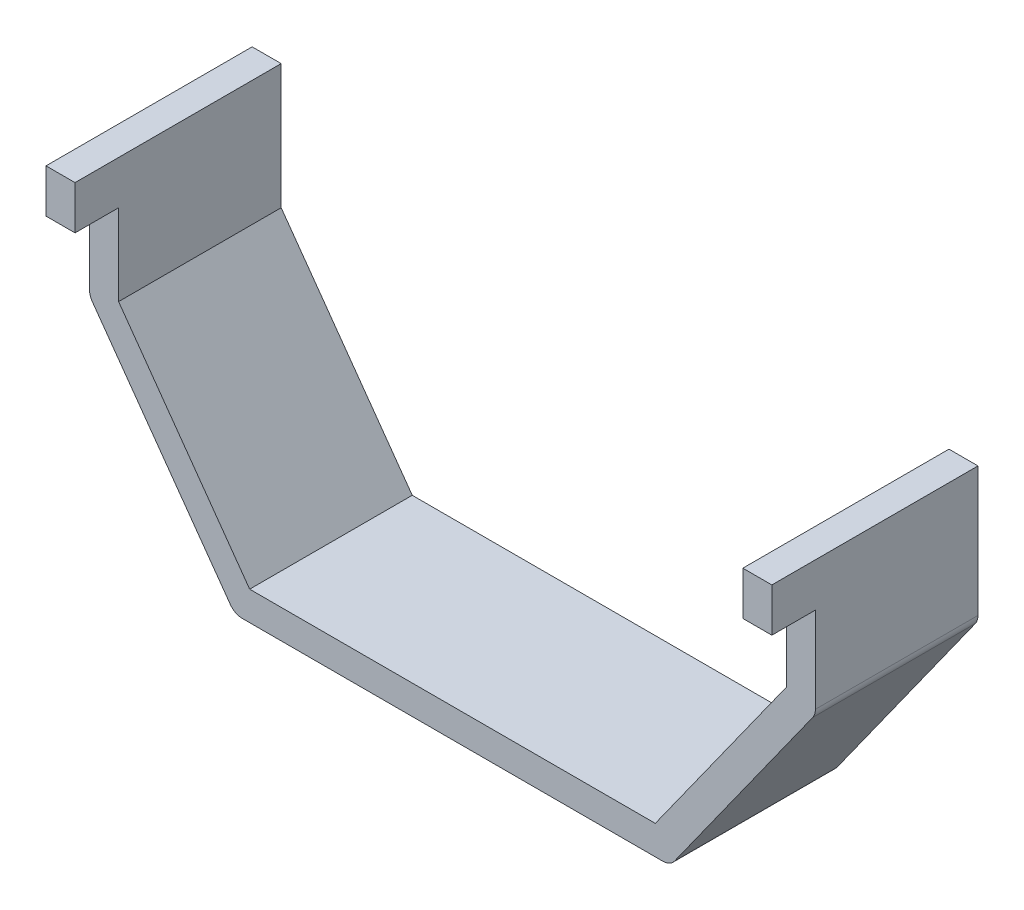
ISO-10303-21;
HEADER;
FILE_DESCRIPTION(('STEP AP214'),'2;1');
FILE_NAME('part.step','',(''),(''),'','','');
FILE_SCHEMA(('AUTOMOTIVE_DESIGN { 1 0 10303 214 1 1 1 1 }'));
ENDSEC;
DATA;
#1=APPLICATION_CONTEXT('core data for automotive mechanical design processes');
#2=APPLICATION_PROTOCOL_DEFINITION('international standard','automotive_design',2000,#1);
#3=PRODUCT_CONTEXT('',#1,'mechanical');
#4=PRODUCT('Part','Part','',(#3));
#5=PRODUCT_RELATED_PRODUCT_CATEGORY('part','',(#4));
#6=PRODUCT_DEFINITION_FORMATION('','',#4);
#7=PRODUCT_DEFINITION_CONTEXT('part definition',#1,'design');
#8=PRODUCT_DEFINITION('design','',#6,#7);
#9=PRODUCT_DEFINITION_SHAPE('','',#8);
#10=(LENGTH_UNIT() NAMED_UNIT(*) SI_UNIT(.MILLI.,.METRE.));
#11=(NAMED_UNIT(*) PLANE_ANGLE_UNIT() SI_UNIT($,.RADIAN.));
#12=(NAMED_UNIT(*) SI_UNIT($,.STERADIAN.) SOLID_ANGLE_UNIT());
#13=UNCERTAINTY_MEASURE_WITH_UNIT(LENGTH_MEASURE(1.E-05),#10,'distance_accuracy_value','');
#14=(GEOMETRIC_REPRESENTATION_CONTEXT(3) GLOBAL_UNCERTAINTY_ASSIGNED_CONTEXT((#13)) GLOBAL_UNIT_ASSIGNED_CONTEXT((#10,
#11,#12)) REPRESENTATION_CONTEXT('',''));
#15=CARTESIAN_POINT('',(0.,0.,0.));
#16=DIRECTION('',(0.,0.,1.));
#17=DIRECTION('',(1.,0.,0.));
#18=AXIS2_PLACEMENT_3D('',#15,#16,#17);
#19=CARTESIAN_POINT('',(-124.998147320026,69.9973261243957,71.));
#20=DIRECTION('',(0.813733156526339,0.581238634271398,0.));
#21=DIRECTION('',(-0.581238634271398,0.81373315652634,0.));
#22=AXIS2_PLACEMENT_3D('',#19,#20,#21);
#23=PLANE('',#22);
#24=DIRECTION('',(0.581238634271398,-0.81373315652634,0.));
#25=VECTOR('',#24,1.);
#26=CARTESIAN_POINT('',(-124.998147320026,69.9973261243957,56.));
#27=LINE('',#26,#25);
#28=CARTESIAN_POINT('',(-124.066813102657,68.6934597125732,56.));
#29=VERTEX_POINT('',#28);
#30=CARTESIAN_POINT('',(-76.4955780181107,2.09380682864299,56.));
#31=VERTEX_POINT('',#30);
#32=EDGE_CURVE('E315',#29,#31,#27,.T.);
#33=ORIENTED_EDGE('',*,*,#32,.F.);
#34=DIRECTION('',(0.,0.,-1.));
#35=VECTOR('',#34,1.);
#36=CARTESIAN_POINT('',(-124.066813102657,68.6934597125732,71.));
#37=LINE('',#36,#35);
#38=CARTESIAN_POINT('',(-124.066813102657,68.6934597125732,0.));
#39=VERTEX_POINT('',#38);
#40=EDGE_CURVE('E264',#29,#39,#37,.T.);
#41=ORIENTED_EDGE('',*,*,#40,.T.);
#42=DIRECTION('',(0.581238634271398,-0.813733156526339,0.));
#43=VECTOR('',#42,1.);
#44=CARTESIAN_POINT('',(-124.998147320026,69.9973261243957,0.));
#45=LINE('',#44,#43);
#46=CARTESIAN_POINT('',(-76.4955780181107,2.09380682864303,0.));
#47=VERTEX_POINT('',#46);
#48=EDGE_CURVE('E216',#39,#47,#45,.T.);
#49=ORIENTED_EDGE('',*,*,#48,.T.);
#50=DIRECTION('',(0.,0.,-1.));
#51=VECTOR('',#50,1.);
#52=CARTESIAN_POINT('',(-76.4955780181107,2.09380682864301,71.));
#53=LINE('',#52,#51);
#54=EDGE_CURVE('E262',#47,#31,#53,.F.);
#55=ORIENTED_EDGE('',*,*,#54,.T.);
#56=EDGE_LOOP('',(#33,#41,#49,#55));
#57=FACE_BOUND('',#56,.T.);
#58=ADVANCED_FACE('F33',(#57),#23,.F.);
#59=CARTESIAN_POINT('',(-75.,0.,71.));
#60=DIRECTION('',(0.,1.,0.));
#61=DIRECTION('',(-1.,0.,0.));
#62=AXIS2_PLACEMENT_3D('',#59,#60,#61);
#63=PLANE('',#62);
#64=DIRECTION('',(1.,0.,0.));
#65=VECTOR('',#64,1.);
#66=CARTESIAN_POINT('',(-75.,0.,56.));
#67=LINE('',#66,#65);
#68=CARTESIAN_POINT('',(-72.426912235479,0.,56.));
#69=VERTEX_POINT('',#68);
#70=CARTESIAN_POINT('',(72.4270796226592,0.,56.));
#71=VERTEX_POINT('',#70);
#72=EDGE_CURVE('E307',#69,#71,#67,.T.);
#73=ORIENTED_EDGE('',*,*,#72,.F.);
#74=DIRECTION('',(0.,0.,-1.));
#75=VECTOR('',#74,1.);
#76=CARTESIAN_POINT('',(-72.426912235479,0.,71.));
#77=LINE('',#76,#75);
#78=CARTESIAN_POINT('',(-72.426912235479,0.,0.));
#79=VERTEX_POINT('',#78);
#80=EDGE_CURVE('E286',#69,#79,#77,.T.);
#81=ORIENTED_EDGE('',*,*,#80,.T.);
#82=DIRECTION('',(1.,0.,0.));
#83=VECTOR('',#82,1.);
#84=CARTESIAN_POINT('',(-75.,0.,0.));
#85=LINE('',#84,#83);
#86=CARTESIAN_POINT('',(72.4270796226592,0.,0.));
#87=VERTEX_POINT('',#86);
#88=EDGE_CURVE('E220',#79,#87,#85,.T.);
#89=ORIENTED_EDGE('',*,*,#88,.T.);
#90=DIRECTION('',(0.,0.,-1.));
#91=VECTOR('',#90,1.);
#92=CARTESIAN_POINT('',(72.4270796226592,0.,71.));
#93=LINE('',#92,#91);
#94=EDGE_CURVE('E284',#87,#71,#93,.F.);
#95=ORIENTED_EDGE('',*,*,#94,.T.);
#96=EDGE_LOOP('',(#73,#81,#89,#95));
#97=FACE_BOUND('',#96,.T.);
#98=ADVANCED_FACE('F340',(#97),#63,.F.);
#99=CARTESIAN_POINT('',(75.,0.,71.));
#100=DIRECTION('',(-0.813702386626155,0.581281709671739,0.));
#101=DIRECTION('',(-0.581281709671739,-0.813702386626155,0.));
#102=AXIS2_PLACEMENT_3D('',#99,#100,#101);
#103=PLANE('',#102);
#104=DIRECTION('',(0.581281709671739,0.813702386626155,0.));
#105=VECTOR('',#104,1.);
#106=CARTESIAN_POINT('',(75.,0.,56.));
#107=LINE('',#106,#105);
#108=CARTESIAN_POINT('',(76.4955915557899,2.09359145164133,56.));
#109=VERTEX_POINT('',#108);
#110=CARTESIAN_POINT('',(124.070364599094,68.6907434425326,56.));
#111=VERTEX_POINT('',#110);
#112=EDGE_CURVE('E293',#109,#111,#107,.T.);
#113=ORIENTED_EDGE('',*,*,#112,.F.);
#114=DIRECTION('',(0.,0.,-1.));
#115=VECTOR('',#114,1.);
#116=CARTESIAN_POINT('',(76.4955915557899,2.09359145164133,71.));
#117=LINE('',#116,#115);
#118=CARTESIAN_POINT('',(76.4955915557899,2.09359145164133,0.));
#119=VERTEX_POINT('',#118);
#120=EDGE_CURVE('E41',#109,#119,#117,.T.);
#121=ORIENTED_EDGE('',*,*,#120,.T.);
#122=DIRECTION('',(0.581281709671739,0.813702386626155,0.));
#123=VECTOR('',#122,1.);
#124=CARTESIAN_POINT('',(75.,0.,0.));
#125=LINE('',#124,#123);
#126=CARTESIAN_POINT('',(124.070364599094,68.6907434425326,0.));
#127=VERTEX_POINT('',#126);
#128=EDGE_CURVE('E223',#119,#127,#125,.T.);
#129=ORIENTED_EDGE('',*,*,#128,.T.);
#130=DIRECTION('',(0.,0.,-1.));
#131=VECTOR('',#130,1.);
#132=CARTESIAN_POINT('',(124.070364599094,68.6907434425326,71.));
#133=LINE('',#132,#131);
#134=EDGE_CURVE('E56',#127,#111,#133,.F.);
#135=ORIENTED_EDGE('',*,*,#134,.T.);
#136=EDGE_LOOP('',(#113,#121,#129,#135));
#137=FACE_BOUND('',#136,.T.);
#138=ADVANCED_FACE('F292',(#137),#103,.F.);
#139=CARTESIAN_POINT('',(115.001852665963,73.1996246842009,71.));
#140=DIRECTION('',(0.813702386626155,-0.581281709671739,0.));
#141=DIRECTION('',(0.581281709671739,0.813702386626155,0.));
#142=AXIS2_PLACEMENT_3D('',#139,#140,#141);
#143=PLANE('',#142);
#144=DIRECTION('',(-0.581281709671739,-0.813702386626155,0.));
#145=VECTOR('',#144,1.);
#146=CARTESIAN_POINT('',(115.001852665963,73.1996246842009,56.));
#147=LINE('',#146,#145);
#148=CARTESIAN_POINT('',(115.001852665963,73.1996246842009,56.));
#149=VERTEX_POINT('',#148);
#150=CARTESIAN_POINT('',(69.8541592453183,9.99999999999998,56.));
#151=VERTEX_POINT('',#150);
#152=EDGE_CURVE('E309',#149,#151,#147,.T.);
#153=ORIENTED_EDGE('',*,*,#152,.F.);
#154=DIRECTION('',(0.,0.,-1.));
#155=VECTOR('',#154,1.);
#156=CARTESIAN_POINT('',(115.001852665963,73.1996246842009,71.));
#157=LINE('',#156,#155);
#158=CARTESIAN_POINT('',(115.001852665963,73.1996246842009,0.));
#159=VERTEX_POINT('',#158);
#160=EDGE_CURVE('E255',#149,#159,#157,.T.);
#161=ORIENTED_EDGE('',*,*,#160,.T.);
#162=DIRECTION('',(-0.581281709671739,-0.813702386626155,0.));
#163=VECTOR('',#162,1.);
#164=CARTESIAN_POINT('',(115.001852665963,73.1996246842009,0.));
#165=LINE('',#164,#163);
#166=CARTESIAN_POINT('',(69.8541592453183,9.99999999999998,0.));
#167=VERTEX_POINT('',#166);
#168=EDGE_CURVE('E232',#159,#167,#165,.T.);
#169=ORIENTED_EDGE('',*,*,#168,.T.);
#170=DIRECTION('',(0.,0.,-1.));
#171=VECTOR('',#170,1.);
#172=CARTESIAN_POINT('',(69.8541592453183,9.99999999999998,71.));
#173=LINE('',#172,#171);
#174=EDGE_CURVE('E253',#151,#167,#173,.T.);
#175=ORIENTED_EDGE('',*,*,#174,.F.);
#176=EDGE_LOOP('',(#153,#161,#169,#175));
#177=FACE_BOUND('',#176,.T.);
#178=ADVANCED_FACE('F397',(#177),#143,.F.);
#179=CARTESIAN_POINT('',(69.8541592453183,9.99999999999998,71.));
#180=DIRECTION('',(0.,-1.,0.));
#181=DIRECTION('',(1.,0.,0.));
#182=AXIS2_PLACEMENT_3D('',#179,#180,#181);
#183=PLANE('',#182);
#184=DIRECTION('',(-1.,0.,0.));
#185=VECTOR('',#184,1.);
#186=CARTESIAN_POINT('',(69.8541592453183,9.99999999999998,56.));
#187=LINE('',#186,#185);
#188=CARTESIAN_POINT('',(-69.8538244709579,9.99999999999998,56.));
#189=VERTEX_POINT('',#188);
#190=EDGE_CURVE('E568',#151,#189,#187,.T.);
#191=ORIENTED_EDGE('',*,*,#190,.F.);
#192=ORIENTED_EDGE('',*,*,#174,.T.);
#193=DIRECTION('',(-1.,0.,0.));
#194=VECTOR('',#193,1.);
#195=CARTESIAN_POINT('',(69.8541592453183,9.99999999999998,0.));
#196=LINE('',#195,#194);
#197=CARTESIAN_POINT('',(-69.8538244709579,9.99999999999998,0.));
#198=VERTEX_POINT('',#197);
#199=EDGE_CURVE('E235',#167,#198,#196,.T.);
#200=ORIENTED_EDGE('',*,*,#199,.T.);
#201=DIRECTION('',(0.,0.,-1.));
#202=VECTOR('',#201,1.);
#203=CARTESIAN_POINT('',(-69.8538244709579,9.99999999999998,71.));
#204=LINE('',#203,#202);
#205=EDGE_CURVE('E251',#189,#198,#204,.T.);
#206=ORIENTED_EDGE('',*,*,#205,.F.);
#207=EDGE_LOOP('',(#191,#192,#200,#206));
#208=FACE_BOUND('',#207,.T.);
#209=ADVANCED_FACE('F393',(#208),#183,.F.);
#210=CARTESIAN_POINT('',(-114.998147320026,73.2019796434646,71.));
#211=DIRECTION('',(-0.813733156526339,-0.581238634271398,0.));
#212=DIRECTION('',(0.581238634271398,-0.813733156526339,0.));
#213=AXIS2_PLACEMENT_3D('',#210,#211,#212);
#214=PLANE('',#213);
#215=DIRECTION('',(-0.581238634271398,0.813733156526339,0.));
#216=VECTOR('',#215,1.);
#217=CARTESIAN_POINT('',(-114.998147320026,73.2019796434646,56.));
#218=LINE('',#217,#216);
#219=CARTESIAN_POINT('',(-114.998147320026,73.2019796434646,56.));
#220=VERTEX_POINT('',#219);
#221=EDGE_CURVE('E566',#189,#220,#218,.T.);
#222=ORIENTED_EDGE('',*,*,#221,.F.);
#223=ORIENTED_EDGE('',*,*,#205,.T.);
#224=DIRECTION('',(-0.581238634271398,0.813733156526339,0.));
#225=VECTOR('',#224,1.);
#226=CARTESIAN_POINT('',(-114.998147320026,73.2019796434646,0.));
#227=LINE('',#226,#225);
#228=CARTESIAN_POINT('',(-114.998147320026,73.2019796434646,0.));
#229=VERTEX_POINT('',#228);
#230=EDGE_CURVE('E238',#198,#229,#227,.T.);
#231=ORIENTED_EDGE('',*,*,#230,.T.);
#232=DIRECTION('',(0.,0.,-1.));
#233=VECTOR('',#232,1.);
#234=CARTESIAN_POINT('',(-114.998147320026,73.2019796434646,71.));
#235=LINE('',#234,#233);
#236=EDGE_CURVE('E249',#220,#229,#235,.T.);
#237=ORIENTED_EDGE('',*,*,#236,.F.);
#238=EDGE_LOOP('',(#222,#223,#231,#237));
#239=FACE_BOUND('',#238,.T.);
#240=ADVANCED_FACE('F390',(#239),#214,.F.);
#241=CARTESIAN_POINT('',(0.,0.,71.));
#242=DIRECTION('',(0.,0.,1.));
#243=DIRECTION('',(1.,0.,0.));
#244=AXIS2_PLACEMENT_3D('',#241,#242,#243);
#245=PLANE('',#244);
#246=DIRECTION('',(-1.,0.,0.));
#247=VECTOR('',#246,1.);
#248=CARTESIAN_POINT('',(0.,101.194679297583,71.));
#249=LINE('',#248,#247);
#250=CARTESIAN_POINT('',(125.001852665963,101.194679297584,71.));
#251=VERTEX_POINT('',#250);
#252=CARTESIAN_POINT('',(115.001852665963,101.194679297584,71.));
#253=VERTEX_POINT('',#252);
#254=EDGE_CURVE('E175',#251,#253,#249,.T.);
#255=ORIENTED_EDGE('',*,*,#254,.F.);
#256=DIRECTION('',(0.,1.,0.));
#257=VECTOR('',#256,1.);
#258=CARTESIAN_POINT('',(125.001852665963,69.9946792975819,71.));
#259=LINE('',#258,#257);
#260=CARTESIAN_POINT('',(125.001852665963,116.194679297584,71.));
#261=VERTEX_POINT('',#260);
#262=EDGE_CURVE('E187',#251,#261,#259,.T.);
#263=ORIENTED_EDGE('',*,*,#262,.T.);
#264=DIRECTION('',(-1.,0.,0.));
#265=VECTOR('',#264,1.);
#266=CARTESIAN_POINT('',(125.001852665963,116.194679297584,71.));
#267=LINE('',#266,#265);
#268=CARTESIAN_POINT('',(115.001852665963,116.194679297584,71.));
#269=VERTEX_POINT('',#268);
#270=EDGE_CURVE('E198',#261,#269,#267,.T.);
#271=ORIENTED_EDGE('',*,*,#270,.T.);
#272=DIRECTION('',(0.,-1.,0.));
#273=VECTOR('',#272,1.);
#274=CARTESIAN_POINT('',(115.001852665963,116.194679297584,71.));
#275=LINE('',#274,#273);
#276=EDGE_CURVE('E190',#269,#253,#275,.T.);
#277=ORIENTED_EDGE('',*,*,#276,.T.);
#278=EDGE_LOOP('',(#255,#263,#271,#277));
#279=FACE_BOUND('',#278,.T.);
#280=ADVANCED_FACE('F186',(#279),#245,.T.);
#281=CARTESIAN_POINT('',(-124.998147320026,116.197326124396,71.));
#282=DIRECTION('',(1.,0.,0.));
#283=DIRECTION('',(0.,0.,-1.));
#284=AXIS2_PLACEMENT_3D('',#281,#282,#283);
#285=PLANE('',#284);
#286=DIRECTION('',(0.,-1.,0.));
#287=VECTOR('',#286,1.);
#288=CARTESIAN_POINT('',(-124.998147320026,116.197326124396,0.));
#289=LINE('',#288,#287);
#290=CARTESIAN_POINT('',(-124.998147320026,116.197326124396,0.));
#291=VERTEX_POINT('',#290);
#292=CARTESIAN_POINT('',(-124.998147320026,71.5996528839302,0.));
#293=VERTEX_POINT('',#292);
#294=EDGE_CURVE('E213',#291,#293,#289,.T.);
#295=ORIENTED_EDGE('',*,*,#294,.T.);
#296=DIRECTION('',(0.,0.,-1.));
#297=VECTOR('',#296,1.);
#298=CARTESIAN_POINT('',(-124.998147320026,71.5996528839301,71.));
#299=LINE('',#298,#297);
#300=CARTESIAN_POINT('',(-124.998147320026,71.5996528839301,56.));
#301=VERTEX_POINT('',#300);
#302=EDGE_CURVE('E275',#293,#301,#299,.F.);
#303=ORIENTED_EDGE('',*,*,#302,.T.);
#304=DIRECTION('',(0.,-1.,0.));
#305=VECTOR('',#304,1.);
#306=CARTESIAN_POINT('',(-124.998147320026,116.197326124396,56.));
#307=LINE('',#306,#305);
#308=CARTESIAN_POINT('',(-124.998147320026,101.194679297583,56.));
#309=VERTEX_POINT('',#308);
#310=EDGE_CURVE('E217',#309,#301,#307,.T.);
#311=ORIENTED_EDGE('',*,*,#310,.F.);
#312=DIRECTION('',(0.,0.,1.));
#313=VECTOR('',#312,1.);
#314=CARTESIAN_POINT('',(-124.998147320026,101.194679297583,71.));
#315=LINE('',#314,#313);
#316=CARTESIAN_POINT('',(-124.998147320026,101.194679297583,71.));
#317=VERTEX_POINT('',#316);
#318=EDGE_CURVE('E181',#309,#317,#315,.T.);
#319=ORIENTED_EDGE('',*,*,#318,.T.);
#320=DIRECTION('',(0.,-1.,0.));
#321=VECTOR('',#320,1.);
#322=CARTESIAN_POINT('',(-124.998147320026,116.197326124396,71.));
#323=LINE('',#322,#321);
#324=CARTESIAN_POINT('',(-124.998147320026,116.197326124396,71.));
#325=VERTEX_POINT('',#324);
#326=EDGE_CURVE('E199',#325,#317,#323,.T.);
#327=ORIENTED_EDGE('',*,*,#326,.F.);
#328=DIRECTION('',(0.,0.,-1.));
#329=VECTOR('',#328,1.);
#330=CARTESIAN_POINT('',(-124.998147320026,116.197326124396,71.));
#331=LINE('',#330,#329);
#332=EDGE_CURVE('E212',#325,#291,#331,.T.);
#333=ORIENTED_EDGE('',*,*,#332,.T.);
#334=EDGE_LOOP('',(#295,#303,#311,#319,#327,#333));
#335=FACE_BOUND('',#334,.T.);
#336=ADVANCED_FACE('F359',(#335),#285,.F.);
#337=CARTESIAN_POINT('',(125.001852665963,69.9946792975819,71.));
#338=DIRECTION('',(-1.,0.,0.));
#339=DIRECTION('',(0.,0.,1.));
#340=AXIS2_PLACEMENT_3D('',#337,#338,#339);
#341=PLANE('',#340);
#342=DIRECTION('',(0.,1.,0.));
#343=VECTOR('',#342,1.);
#344=CARTESIAN_POINT('',(125.001852665963,69.9946792975819,56.));
#345=LINE('',#344,#343);
#346=CARTESIAN_POINT('',(125.001852665963,71.5971519908913,56.));
#347=VERTEX_POINT('',#346);
#348=CARTESIAN_POINT('',(125.001852665963,101.194679297584,56.));
#349=VERTEX_POINT('',#348);
#350=EDGE_CURVE('E304',#347,#349,#345,.T.);
#351=ORIENTED_EDGE('',*,*,#350,.F.);
#352=DIRECTION('',(0.,0.,-1.));
#353=VECTOR('',#352,1.);
#354=CARTESIAN_POINT('',(125.001852665963,71.5971519908913,71.));
#355=LINE('',#354,#353);
#356=CARTESIAN_POINT('',(125.001852665963,71.5971519908913,0.));
#357=VERTEX_POINT('',#356);
#358=EDGE_CURVE('E11',#347,#357,#355,.T.);
#359=ORIENTED_EDGE('',*,*,#358,.T.);
#360=DIRECTION('',(0.,1.,0.));
#361=VECTOR('',#360,1.);
#362=CARTESIAN_POINT('',(125.001852665963,69.9946792975819,0.));
#363=LINE('',#362,#361);
#364=CARTESIAN_POINT('',(125.001852665963,116.194679297584,0.));
#365=VERTEX_POINT('',#364);
#366=EDGE_CURVE('E225',#357,#365,#363,.T.);
#367=ORIENTED_EDGE('',*,*,#366,.T.);
#368=DIRECTION('',(0.,0.,-1.));
#369=VECTOR('',#368,1.);
#370=CARTESIAN_POINT('',(125.001852665963,116.194679297584,71.));
#371=LINE('',#370,#369);
#372=EDGE_CURVE('E196',#261,#365,#371,.T.);
#373=ORIENTED_EDGE('',*,*,#372,.F.);
#374=ORIENTED_EDGE('',*,*,#262,.F.);
#375=DIRECTION('',(0.,0.,-1.));
#376=VECTOR('',#375,1.);
#377=CARTESIAN_POINT('',(125.001852665963,101.194679297584,71.));
#378=LINE('',#377,#376);
#379=EDGE_CURVE('E172',#251,#349,#378,.T.);
#380=ORIENTED_EDGE('',*,*,#379,.T.);
#381=EDGE_LOOP('',(#351,#359,#367,#373,#374,#380));
#382=FACE_BOUND('',#381,.T.);
#383=ADVANCED_FACE('F194',(#382),#341,.F.);
#384=CARTESIAN_POINT('',(125.001852665963,116.194679297584,71.));
#385=DIRECTION('',(0.,-1.,0.));
#386=DIRECTION('',(0.,0.,-1.));
#387=AXIS2_PLACEMENT_3D('',#384,#385,#386);
#388=PLANE('',#387);
#389=DIRECTION('',(-1.,0.,0.));
#390=VECTOR('',#389,1.);
#391=CARTESIAN_POINT('',(125.001852665963,116.194679297584,0.));
#392=LINE('',#391,#390);
#393=CARTESIAN_POINT('',(115.001852665963,116.194679297584,0.));
#394=VERTEX_POINT('',#393);
#395=EDGE_CURVE('E227',#365,#394,#392,.T.);
#396=ORIENTED_EDGE('',*,*,#395,.T.);
#397=DIRECTION('',(0.,0.,-1.));
#398=VECTOR('',#397,1.);
#399=CARTESIAN_POINT('',(115.001852665963,116.194679297584,71.));
#400=LINE('',#399,#398);
#401=EDGE_CURVE('E257',#269,#394,#400,.T.);
#402=ORIENTED_EDGE('',*,*,#401,.F.);
#403=ORIENTED_EDGE('',*,*,#270,.F.);
#404=ORIENTED_EDGE('',*,*,#372,.T.);
#405=EDGE_LOOP('',(#396,#402,#403,#404));
#406=FACE_BOUND('',#405,.T.);
#407=ADVANCED_FACE('F404',(#406),#388,.F.);
#408=CARTESIAN_POINT('',(115.001852665963,116.194679297584,71.));
#409=DIRECTION('',(1.,0.,0.));
#410=DIRECTION('',(0.,0.,-1.));
#411=AXIS2_PLACEMENT_3D('',#408,#409,#410);
#412=PLANE('',#411);
#413=DIRECTION('',(0.,-1.,0.));
#414=VECTOR('',#413,1.);
#415=CARTESIAN_POINT('',(115.001852665963,116.194679297584,56.));
#416=LINE('',#415,#414);
#417=CARTESIAN_POINT('',(115.001852665963,101.194679297584,56.));
#418=VERTEX_POINT('',#417);
#419=EDGE_CURVE('E305',#418,#149,#416,.T.);
#420=ORIENTED_EDGE('',*,*,#419,.F.);
#421=DIRECTION('',(0.,0.,1.));
#422=VECTOR('',#421,1.);
#423=CARTESIAN_POINT('',(115.001852665963,101.194679297584,71.));
#424=LINE('',#423,#422);
#425=EDGE_CURVE('E182',#418,#253,#424,.T.);
#426=ORIENTED_EDGE('',*,*,#425,.T.);
#427=ORIENTED_EDGE('',*,*,#276,.F.);
#428=ORIENTED_EDGE('',*,*,#401,.T.);
#429=DIRECTION('',(0.,-1.,0.));
#430=VECTOR('',#429,1.);
#431=CARTESIAN_POINT('',(115.001852665963,116.194679297584,0.));
#432=LINE('',#431,#430);
#433=EDGE_CURVE('E229',#394,#159,#432,.T.);
#434=ORIENTED_EDGE('',*,*,#433,.T.);
#435=ORIENTED_EDGE('',*,*,#160,.F.);
#436=EDGE_LOOP('',(#420,#426,#427,#428,#434,#435));
#437=FACE_BOUND('',#436,.T.);
#438=ADVANCED_FACE('F388',(#437),#412,.F.);
#439=CARTESIAN_POINT('',(-114.998147320026,116.197326124396,71.));
#440=DIRECTION('',(-1.,0.,0.));
#441=DIRECTION('',(0.,0.,1.));
#442=AXIS2_PLACEMENT_3D('',#439,#440,#441);
#443=PLANE('',#442);
#444=DIRECTION('',(0.,1.,0.));
#445=VECTOR('',#444,1.);
#446=CARTESIAN_POINT('',(-114.998147320026,116.197326124396,71.));
#447=LINE('',#446,#445);
#448=CARTESIAN_POINT('',(-114.998147320026,101.194679297583,71.));
#449=VERTEX_POINT('',#448);
#450=CARTESIAN_POINT('',(-114.998147320026,116.197326124396,71.));
#451=VERTEX_POINT('',#450);
#452=EDGE_CURVE('E208',#449,#451,#447,.T.);
#453=ORIENTED_EDGE('',*,*,#452,.F.);
#454=DIRECTION('',(0.,0.,-1.));
#455=VECTOR('',#454,1.);
#456=CARTESIAN_POINT('',(-114.998147320026,101.194679297583,71.));
#457=LINE('',#456,#455);
#458=CARTESIAN_POINT('',(-114.998147320026,101.194679297583,56.));
#459=VERTEX_POINT('',#458);
#460=EDGE_CURVE('E561',#449,#459,#457,.T.);
#461=ORIENTED_EDGE('',*,*,#460,.T.);
#462=DIRECTION('',(0.,1.,0.));
#463=VECTOR('',#462,1.);
#464=CARTESIAN_POINT('',(-114.998147320026,116.197326124396,56.));
#465=LINE('',#464,#463);
#466=EDGE_CURVE('E191',#220,#459,#465,.T.);
#467=ORIENTED_EDGE('',*,*,#466,.F.);
#468=ORIENTED_EDGE('',*,*,#236,.T.);
#469=DIRECTION('',(0.,1.,0.));
#470=VECTOR('',#469,1.);
#471=CARTESIAN_POINT('',(-114.998147320026,116.197326124396,0.));
#472=LINE('',#471,#470);
#473=CARTESIAN_POINT('',(-114.998147320026,116.197326124396,0.));
#474=VERTEX_POINT('',#473);
#475=EDGE_CURVE('E241',#229,#474,#472,.T.);
#476=ORIENTED_EDGE('',*,*,#475,.T.);
#477=DIRECTION('',(0.,0.,-1.));
#478=VECTOR('',#477,1.);
#479=CARTESIAN_POINT('',(-114.998147320026,116.197326124396,71.));
#480=LINE('',#479,#478);
#481=EDGE_CURVE('E246',#451,#474,#480,.T.);
#482=ORIENTED_EDGE('',*,*,#481,.F.);
#483=EDGE_LOOP('',(#453,#461,#467,#468,#476,#482));
#484=FACE_BOUND('',#483,.T.);
#485=ADVANCED_FACE('F384',(#484),#443,.F.);
#486=CARTESIAN_POINT('',(-124.998147320026,116.197326124396,71.));
#487=DIRECTION('',(0.,-1.,0.));
#488=DIRECTION('',(0.,0.,-1.));
#489=AXIS2_PLACEMENT_3D('',#486,#487,#488);
#490=PLANE('',#489);
#491=DIRECTION('',(-1.,0.,0.));
#492=VECTOR('',#491,1.);
#493=CARTESIAN_POINT('',(-124.998147320026,116.197326124396,0.));
#494=LINE('',#493,#492);
#495=EDGE_CURVE('E203',#474,#291,#494,.T.);
#496=ORIENTED_EDGE('',*,*,#495,.T.);
#497=ORIENTED_EDGE('',*,*,#332,.F.);
#498=DIRECTION('',(-1.,0.,0.));
#499=VECTOR('',#498,1.);
#500=CARTESIAN_POINT('',(-124.998147320026,116.197326124396,71.));
#501=LINE('',#500,#499);
#502=EDGE_CURVE('E210',#451,#325,#501,.T.);
#503=ORIENTED_EDGE('',*,*,#502,.F.);
#504=ORIENTED_EDGE('',*,*,#481,.T.);
#505=EDGE_LOOP('',(#496,#497,#503,#504));
#506=FACE_BOUND('',#505,.T.);
#507=ADVANCED_FACE('F377',(#506),#490,.F.);
#508=EDGE_CURVE('E192',#449,#317,#249,.T.);
#509=ORIENTED_EDGE('',*,*,#508,.F.);
#510=ORIENTED_EDGE('',*,*,#452,.T.);
#511=ORIENTED_EDGE('',*,*,#502,.T.);
#512=ORIENTED_EDGE('',*,*,#326,.T.);
#513=EDGE_LOOP('',(#509,#510,#511,#512));
#514=FACE_BOUND('',#513,.T.);
#515=ADVANCED_FACE('F374',(#514),#245,.T.);
#516=CARTESIAN_POINT('',(0.,0.,0.));
#517=DIRECTION('',(0.,0.,1.));
#518=DIRECTION('',(1.,0.,0.));
#519=AXIS2_PLACEMENT_3D('',#516,#517,#518);
#520=PLANE('',#519);
#521=CARTESIAN_POINT('',(-72.426912235479,4.99999999999998,0.));
#522=DIRECTION('',(0.,0.,-1.));
#523=DIRECTION('',(-1.,0.,0.));
#524=AXIS2_PLACEMENT_3D('',#521,#522,#523);
#525=CIRCLE('',#524,2.);
#526=CARTESIAN_POINT('',(-74.426912235479,4.99999999999998,0.));
#527=VERTEX_POINT('',#526);
#528=EDGE_CURVE('E538',#527,#527,#525,.T.);
#529=ORIENTED_EDGE('',*,*,#528,.F.);
#530=EDGE_LOOP('',(#529));
#531=FACE_BOUND('',#530,.T.);
#532=CARTESIAN_POINT('',(120.001852665963,111.194679297584,0.));
#533=DIRECTION('',(0.,0.,-1.));
#534=DIRECTION('',(-1.,0.,0.));
#535=AXIS2_PLACEMENT_3D('',#532,#533,#534);
#536=CIRCLE('',#535,2.);
#537=CARTESIAN_POINT('',(118.001852665963,111.194679297584,0.));
#538=VERTEX_POINT('',#537);
#539=EDGE_CURVE('E549',#538,#538,#536,.T.);
#540=ORIENTED_EDGE('',*,*,#539,.F.);
#541=EDGE_LOOP('',(#540));
#542=FACE_BOUND('',#541,.T.);
#543=CARTESIAN_POINT('',(-119.998147320026,111.197326124396,0.));
#544=DIRECTION('',(0.,0.,-1.));
#545=DIRECTION('',(-1.,0.,0.));
#546=AXIS2_PLACEMENT_3D('',#543,#544,#545);
#547=CIRCLE('',#546,2.);
#548=CARTESIAN_POINT('',(-121.998147320026,111.197326124396,0.));
#549=VERTEX_POINT('',#548);
#550=EDGE_CURVE('E555',#549,#549,#547,.T.);
#551=ORIENTED_EDGE('',*,*,#550,.F.);
#552=EDGE_LOOP('',(#551));
#553=FACE_BOUND('',#552,.T.);
#554=CARTESIAN_POINT('',(72.4270796226591,4.99999999999998,0.));
#555=DIRECTION('',(0.,0.,-1.));
#556=DIRECTION('',(-1.,0.,0.));
#557=AXIS2_PLACEMENT_3D('',#554,#555,#556);
#558=CIRCLE('',#557,2.);
#559=CARTESIAN_POINT('',(70.4270796226591,4.99999999999998,0.));
#560=VERTEX_POINT('',#559);
#561=EDGE_CURVE('E537',#560,#560,#558,.T.);
#562=ORIENTED_EDGE('',*,*,#561,.F.);
#563=EDGE_LOOP('',(#562));
#564=FACE_BOUND('',#563,.T.);
#565=ORIENTED_EDGE('',*,*,#48,.F.);
#566=CARTESIAN_POINT('',(-119.998147320026,71.5996528839301,0.));
#567=DIRECTION('',(0.,0.,1.));
#568=DIRECTION('',(1.,0.,0.));
#569=AXIS2_PLACEMENT_3D('',#566,#567,#568);
#570=CIRCLE('',#569,5.);
#571=EDGE_CURVE('E273',#39,#293,#570,.F.);
#572=ORIENTED_EDGE('',*,*,#571,.T.);
#573=ORIENTED_EDGE('',*,*,#294,.F.);
#574=ORIENTED_EDGE('',*,*,#495,.F.);
#575=ORIENTED_EDGE('',*,*,#475,.F.);
#576=ORIENTED_EDGE('',*,*,#230,.F.);
#577=ORIENTED_EDGE('',*,*,#199,.F.);
#578=ORIENTED_EDGE('',*,*,#168,.F.);
#579=ORIENTED_EDGE('',*,*,#433,.F.);
#580=ORIENTED_EDGE('',*,*,#395,.F.);
#581=ORIENTED_EDGE('',*,*,#366,.F.);
#582=CARTESIAN_POINT('',(120.001852665963,71.5971519908913,0.));
#583=DIRECTION('',(0.,0.,1.));
#584=DIRECTION('',(1.,0.,0.));
#585=AXIS2_PLACEMENT_3D('',#582,#583,#584);
#586=CIRCLE('',#585,5.);
#587=EDGE_CURVE('E267',#357,#127,#586,.F.);
#588=ORIENTED_EDGE('',*,*,#587,.T.);
#589=ORIENTED_EDGE('',*,*,#128,.F.);
#590=CARTESIAN_POINT('',(72.4270796226592,5.00000000000003,0.));
#591=DIRECTION('',(0.,0.,1.));
#592=DIRECTION('',(1.,0.,0.));
#593=AXIS2_PLACEMENT_3D('',#590,#591,#592);
#594=CIRCLE('',#593,5.);
#595=EDGE_CURVE('E269',#119,#87,#594,.F.);
#596=ORIENTED_EDGE('',*,*,#595,.T.);
#597=ORIENTED_EDGE('',*,*,#88,.F.);
#598=CARTESIAN_POINT('',(-72.426912235479,5.,0.));
#599=DIRECTION('',(0.,0.,1.));
#600=DIRECTION('',(1.,0.,0.));
#601=AXIS2_PLACEMENT_3D('',#598,#599,#600);
#602=CIRCLE('',#601,5.);
#603=EDGE_CURVE('E271',#79,#47,#602,.F.);
#604=ORIENTED_EDGE('',*,*,#603,.T.);
#605=EDGE_LOOP('',(#565,#572,#573,#574,#575,#576,#577,#578,#579,#580,#581,#588,#589,#596,#597,#604));
#606=FACE_BOUND('',#605,.T.);
#607=ADVANCED_FACE('F298',(#531,#542,#553,#564,#606),#520,.F.);
#608=CARTESIAN_POINT('',(0.,0.,56.));
#609=DIRECTION('',(0.,0.,1.));
#610=DIRECTION('',(1.,0.,0.));
#611=AXIS2_PLACEMENT_3D('',#608,#609,#610);
#612=PLANE('',#611);
#613=ORIENTED_EDGE('',*,*,#310,.T.);
#614=CARTESIAN_POINT('',(-119.998147320026,71.5996528839301,56.));
#615=DIRECTION('',(0.,0.,1.));
#616=DIRECTION('',(1.,0.,0.));
#617=AXIS2_PLACEMENT_3D('',#614,#615,#616);
#618=CIRCLE('',#617,5.);
#619=EDGE_CURVE('E282',#301,#29,#618,.T.);
#620=ORIENTED_EDGE('',*,*,#619,.T.);
#621=ORIENTED_EDGE('',*,*,#32,.T.);
#622=CARTESIAN_POINT('',(-72.426912235479,5.,56.));
#623=DIRECTION('',(0.,0.,1.));
#624=DIRECTION('',(1.,0.,0.));
#625=AXIS2_PLACEMENT_3D('',#622,#623,#624);
#626=CIRCLE('',#625,5.);
#627=EDGE_CURVE('E280',#31,#69,#626,.T.);
#628=ORIENTED_EDGE('',*,*,#627,.T.);
#629=ORIENTED_EDGE('',*,*,#72,.T.);
#630=CARTESIAN_POINT('',(72.4270796226592,5.00000000000003,56.));
#631=DIRECTION('',(0.,0.,1.));
#632=DIRECTION('',(1.,0.,0.));
#633=AXIS2_PLACEMENT_3D('',#630,#631,#632);
#634=CIRCLE('',#633,5.);
#635=EDGE_CURVE('E278',#71,#109,#634,.T.);
#636=ORIENTED_EDGE('',*,*,#635,.T.);
#637=ORIENTED_EDGE('',*,*,#112,.T.);
#638=CARTESIAN_POINT('',(120.001852665963,71.5971519908913,56.));
#639=DIRECTION('',(0.,0.,1.));
#640=DIRECTION('',(1.,0.,0.));
#641=AXIS2_PLACEMENT_3D('',#638,#639,#640);
#642=CIRCLE('',#641,5.);
#643=EDGE_CURVE('E48',#111,#347,#642,.T.);
#644=ORIENTED_EDGE('',*,*,#643,.T.);
#645=ORIENTED_EDGE('',*,*,#350,.T.);
#646=DIRECTION('',(-1.,0.,0.));
#647=VECTOR('',#646,1.);
#648=CARTESIAN_POINT('',(159.980823121944,101.194679297584,56.));
#649=LINE('',#648,#647);
#650=EDGE_CURVE('E178',#349,#418,#649,.T.);
#651=ORIENTED_EDGE('',*,*,#650,.T.);
#652=ORIENTED_EDGE('',*,*,#419,.T.);
#653=ORIENTED_EDGE('',*,*,#152,.T.);
#654=ORIENTED_EDGE('',*,*,#190,.T.);
#655=ORIENTED_EDGE('',*,*,#221,.T.);
#656=ORIENTED_EDGE('',*,*,#466,.T.);
#657=EDGE_CURVE('E324',#459,#309,#649,.T.);
#658=ORIENTED_EDGE('',*,*,#657,.T.);
#659=EDGE_LOOP('',(#613,#620,#621,#628,#629,#636,#637,#644,#645,#651,#652,#653,#654,#655,#656,#658));
#660=FACE_BOUND('',#659,.T.);
#661=ADVANCED_FACE('F321',(#660),#612,.T.);
#662=CARTESIAN_POINT('',(159.980823121944,101.194679297584,56.));
#663=DIRECTION('',(0.,1.,0.));
#664=DIRECTION('',(-1.,0.,0.));
#665=AXIS2_PLACEMENT_3D('',#662,#663,#664);
#666=PLANE('',#665);
#667=ORIENTED_EDGE('',*,*,#657,.F.);
#668=ORIENTED_EDGE('',*,*,#460,.F.);
#669=ORIENTED_EDGE('',*,*,#508,.T.);
#670=ORIENTED_EDGE('',*,*,#318,.F.);
#671=EDGE_LOOP('',(#667,#668,#669,#670));
#672=FACE_BOUND('',#671,.T.);
#673=ADVANCED_FACE('F366',(#672),#666,.F.);
#674=ORIENTED_EDGE('',*,*,#254,.T.);
#675=ORIENTED_EDGE('',*,*,#425,.F.);
#676=ORIENTED_EDGE('',*,*,#650,.F.);
#677=ORIENTED_EDGE('',*,*,#379,.F.);
#678=EDGE_LOOP('',(#674,#675,#676,#677));
#679=FACE_BOUND('',#678,.T.);
#680=ADVANCED_FACE('F174',(#679),#666,.F.);
#681=CARTESIAN_POINT('',(-119.998147320026,71.5996528839301,71.));
#682=DIRECTION('',(0.,0.,-1.));
#683=DIRECTION('',(-1.,0.,0.));
#684=AXIS2_PLACEMENT_3D('',#681,#682,#683);
#685=CYLINDRICAL_SURFACE('',#684,5.);
#686=ORIENTED_EDGE('',*,*,#619,.F.);
#687=ORIENTED_EDGE('',*,*,#302,.F.);
#688=ORIENTED_EDGE('',*,*,#571,.F.);
#689=ORIENTED_EDGE('',*,*,#40,.F.);
#690=EDGE_LOOP('',(#686,#687,#688,#689));
#691=FACE_BOUND('',#690,.T.);
#692=ADVANCED_FACE('F330',(#691),#685,.T.);
#693=CARTESIAN_POINT('',(-72.426912235479,5.,71.));
#694=DIRECTION('',(0.,0.,-1.));
#695=DIRECTION('',(-1.,0.,0.));
#696=AXIS2_PLACEMENT_3D('',#693,#694,#695);
#697=CYLINDRICAL_SURFACE('',#696,5.);
#698=ORIENTED_EDGE('',*,*,#627,.F.);
#699=ORIENTED_EDGE('',*,*,#54,.F.);
#700=ORIENTED_EDGE('',*,*,#603,.F.);
#701=ORIENTED_EDGE('',*,*,#80,.F.);
#702=EDGE_LOOP('',(#698,#699,#700,#701));
#703=FACE_BOUND('',#702,.T.);
#704=ADVANCED_FACE('F337',(#703),#697,.T.);
#705=CARTESIAN_POINT('',(72.4270796226592,5.00000000000003,71.));
#706=DIRECTION('',(0.,0.,-1.));
#707=DIRECTION('',(-1.,0.,0.));
#708=AXIS2_PLACEMENT_3D('',#705,#706,#707);
#709=CYLINDRICAL_SURFACE('',#708,5.);
#710=ORIENTED_EDGE('',*,*,#635,.F.);
#711=ORIENTED_EDGE('',*,*,#94,.F.);
#712=ORIENTED_EDGE('',*,*,#595,.F.);
#713=ORIENTED_EDGE('',*,*,#120,.F.);
#714=EDGE_LOOP('',(#710,#711,#712,#713));
#715=FACE_BOUND('',#714,.T.);
#716=ADVANCED_FACE('F342',(#715),#709,.T.);
#717=CARTESIAN_POINT('',(120.001852665963,71.5971519908913,71.));
#718=DIRECTION('',(0.,0.,-1.));
#719=DIRECTION('',(-1.,0.,0.));
#720=AXIS2_PLACEMENT_3D('',#717,#718,#719);
#721=CYLINDRICAL_SURFACE('',#720,5.);
#722=ORIENTED_EDGE('',*,*,#643,.F.);
#723=ORIENTED_EDGE('',*,*,#134,.F.);
#724=ORIENTED_EDGE('',*,*,#587,.F.);
#725=ORIENTED_EDGE('',*,*,#358,.F.);
#726=EDGE_LOOP('',(#722,#723,#724,#725));
#727=FACE_BOUND('',#726,.T.);
#728=ADVANCED_FACE('F35',(#727),#721,.T.);
#729=CARTESIAN_POINT('',(72.4270796226591,4.99999999999998,8.));
#730=DIRECTION('',(0.,0.,-1.));
#731=DIRECTION('',(-1.,0.,0.));
#732=AXIS2_PLACEMENT_3D('',#729,#730,#731);
#733=CYLINDRICAL_SURFACE('',#732,2.);
#734=CARTESIAN_POINT('',(72.4270796226591,4.99999999999998,8.));
#735=DIRECTION('',(0.,0.,-1.));
#736=DIRECTION('',(-1.,0.,0.));
#737=AXIS2_PLACEMENT_3D('',#734,#735,#736);
#738=CIRCLE('',#737,2.);
#739=CARTESIAN_POINT('',(70.4270796226591,4.99999999999998,8.));
#740=VERTEX_POINT('',#739);
#741=EDGE_CURVE('E541',#740,#740,#738,.T.);
#742=ORIENTED_EDGE('',*,*,#741,.F.);
#743=EDGE_LOOP('',(#742));
#744=FACE_BOUND('',#743,.T.);
#745=ORIENTED_EDGE('',*,*,#561,.T.);
#746=EDGE_LOOP('',(#745));
#747=FACE_BOUND('',#746,.T.);
#748=ADVANCED_FACE('F348',(#744,#747),#733,.F.);
#749=CARTESIAN_POINT('',(72.4270796226591,4.99999999999998,8.));
#750=DIRECTION('',(0.,0.,-1.));
#751=DIRECTION('',(-1.,0.,0.));
#752=AXIS2_PLACEMENT_3D('',#749,#750,#751);
#753=PLANE('',#752);
#754=ORIENTED_EDGE('',*,*,#741,.T.);
#755=EDGE_LOOP('',(#754));
#756=FACE_BOUND('',#755,.T.);
#757=ADVANCED_FACE('F461',(#756),#753,.T.);
#758=CARTESIAN_POINT('',(-119.998147320026,111.197326124396,8.));
#759=DIRECTION('',(0.,0.,-1.));
#760=DIRECTION('',(-1.,0.,0.));
#761=AXIS2_PLACEMENT_3D('',#758,#759,#760);
#762=CYLINDRICAL_SURFACE('',#761,2.);
#763=CARTESIAN_POINT('',(-119.998147320026,111.197326124396,8.));
#764=DIRECTION('',(0.,0.,-1.));
#765=DIRECTION('',(-1.,0.,0.));
#766=AXIS2_PLACEMENT_3D('',#763,#764,#765);
#767=CIRCLE('',#766,2.);
#768=CARTESIAN_POINT('',(-121.998147320026,111.197326124396,8.));
#769=VERTEX_POINT('',#768);
#770=EDGE_CURVE('E552',#769,#769,#767,.T.);
#771=ORIENTED_EDGE('',*,*,#770,.F.);
#772=EDGE_LOOP('',(#771));
#773=FACE_BOUND('',#772,.T.);
#774=ORIENTED_EDGE('',*,*,#550,.T.);
#775=EDGE_LOOP('',(#774));
#776=FACE_BOUND('',#775,.T.);
#777=ADVANCED_FACE('F470',(#773,#776),#762,.F.);
#778=CARTESIAN_POINT('',(-119.998147320026,111.197326124396,8.));
#779=DIRECTION('',(0.,0.,-1.));
#780=DIRECTION('',(-1.,0.,0.));
#781=AXIS2_PLACEMENT_3D('',#778,#779,#780);
#782=PLANE('',#781);
#783=ORIENTED_EDGE('',*,*,#770,.T.);
#784=EDGE_LOOP('',(#783));
#785=FACE_BOUND('',#784,.T.);
#786=ADVANCED_FACE('F480',(#785),#782,.T.);
#787=CARTESIAN_POINT('',(120.001852665963,111.194679297584,8.));
#788=DIRECTION('',(0.,0.,-1.));
#789=DIRECTION('',(-1.,0.,0.));
#790=AXIS2_PLACEMENT_3D('',#787,#788,#789);
#791=CYLINDRICAL_SURFACE('',#790,2.);
#792=CARTESIAN_POINT('',(120.001852665963,111.194679297584,8.));
#793=DIRECTION('',(0.,0.,-1.));
#794=DIRECTION('',(-1.,0.,0.));
#795=AXIS2_PLACEMENT_3D('',#792,#793,#794);
#796=CIRCLE('',#795,2.);
#797=CARTESIAN_POINT('',(118.001852665963,111.194679297584,8.));
#798=VERTEX_POINT('',#797);
#799=EDGE_CURVE('E544',#798,#798,#796,.T.);
#800=ORIENTED_EDGE('',*,*,#799,.F.);
#801=EDGE_LOOP('',(#800));
#802=FACE_BOUND('',#801,.T.);
#803=ORIENTED_EDGE('',*,*,#539,.T.);
#804=EDGE_LOOP('',(#803));
#805=FACE_BOUND('',#804,.T.);
#806=ADVANCED_FACE('F490',(#802,#805),#791,.F.);
#807=CARTESIAN_POINT('',(120.001852665963,111.194679297584,8.));
#808=DIRECTION('',(0.,0.,-1.));
#809=DIRECTION('',(-1.,0.,0.));
#810=AXIS2_PLACEMENT_3D('',#807,#808,#809);
#811=PLANE('',#810);
#812=ORIENTED_EDGE('',*,*,#799,.T.);
#813=EDGE_LOOP('',(#812));
#814=FACE_BOUND('',#813,.T.);
#815=ADVANCED_FACE('F500',(#814),#811,.T.);
#816=CARTESIAN_POINT('',(-72.426912235479,4.99999999999998,8.));
#817=DIRECTION('',(0.,0.,-1.));
#818=DIRECTION('',(-1.,0.,0.));
#819=AXIS2_PLACEMENT_3D('',#816,#817,#818);
#820=CYLINDRICAL_SURFACE('',#819,2.);
#821=CARTESIAN_POINT('',(-72.426912235479,4.99999999999998,8.));
#822=DIRECTION('',(0.,0.,-1.));
#823=DIRECTION('',(-1.,0.,0.));
#824=AXIS2_PLACEMENT_3D('',#821,#822,#823);
#825=CIRCLE('',#824,2.);
#826=CARTESIAN_POINT('',(-74.426912235479,4.99999999999998,8.));
#827=VERTEX_POINT('',#826);
#828=EDGE_CURVE('E536',#827,#827,#825,.T.);
#829=ORIENTED_EDGE('',*,*,#828,.F.);
#830=EDGE_LOOP('',(#829));
#831=FACE_BOUND('',#830,.T.);
#832=ORIENTED_EDGE('',*,*,#528,.T.);
#833=EDGE_LOOP('',(#832));
#834=FACE_BOUND('',#833,.T.);
#835=ADVANCED_FACE('F510',(#831,#834),#820,.F.);
#836=CARTESIAN_POINT('',(-72.426912235479,4.99999999999998,8.));
#837=DIRECTION('',(0.,0.,-1.));
#838=DIRECTION('',(-1.,0.,0.));
#839=AXIS2_PLACEMENT_3D('',#836,#837,#838);
#840=PLANE('',#839);
#841=ORIENTED_EDGE('',*,*,#828,.T.);
#842=EDGE_LOOP('',(#841));
#843=FACE_BOUND('',#842,.T.);
#844=ADVANCED_FACE('F520',(#843),#840,.T.);
#845=CLOSED_SHELL('',(#58,#98,#138,#178,#209,#240,#280,#336,#383,#407,#438,#485,#507,#515,#607,
#661,#673,#680,#692,#704,#716,#728,#748,#757,#777,#786,#806,#815,#835,#844));
#846=MANIFOLD_SOLID_BREP('B2',#845);
#847=ADVANCED_BREP_SHAPE_REPRESENTATION('',(#18,#846),#14);
#848=SHAPE_DEFINITION_REPRESENTATION(#9,#847);
ENDSEC;
END-ISO-10303-21;
